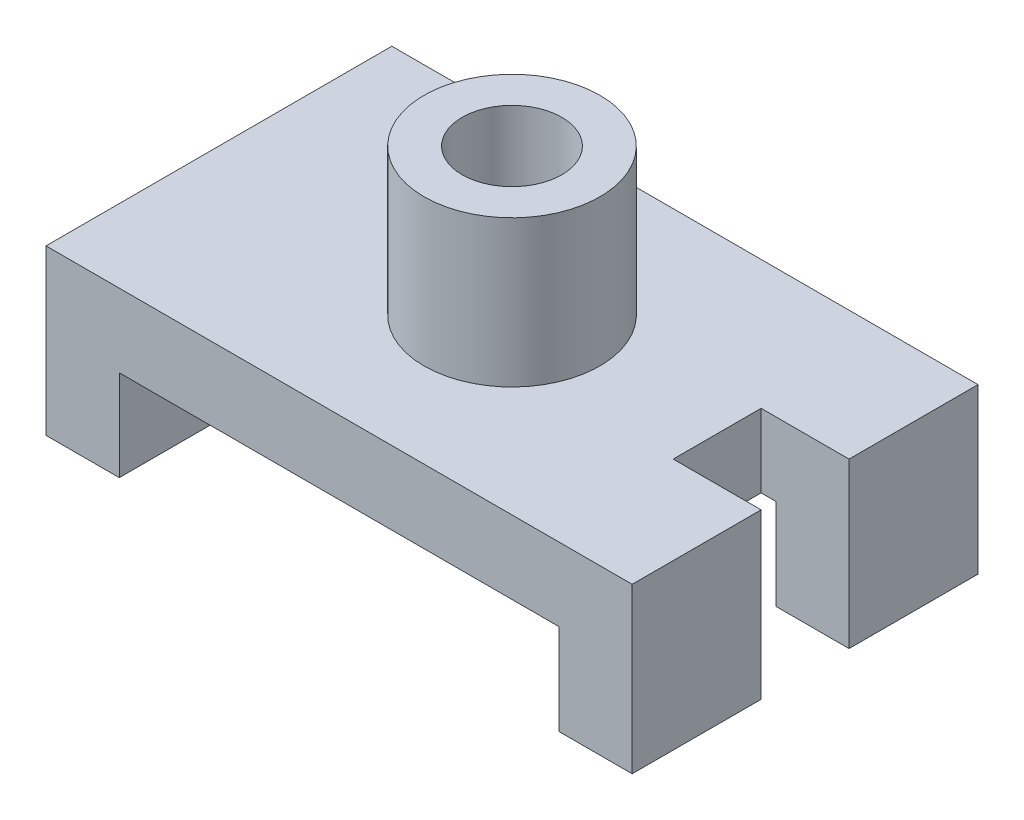
ISO-10303-21;
HEADER;
FILE_DESCRIPTION(('STEP AP214'),'2;1');
FILE_NAME('part.step','',(''),(''),'','','');
FILE_SCHEMA(('AUTOMOTIVE_DESIGN { 1 0 10303 214 1 1 1 1 }'));
ENDSEC;
DATA;
#1=APPLICATION_CONTEXT('core data for automotive mechanical design processes');
#2=APPLICATION_PROTOCOL_DEFINITION('international standard','automotive_design',2000,#1);
#3=PRODUCT_CONTEXT('',#1,'mechanical');
#4=PRODUCT('Part','Part','',(#3));
#5=PRODUCT_RELATED_PRODUCT_CATEGORY('part','',(#4));
#6=PRODUCT_DEFINITION_FORMATION('','',#4);
#7=PRODUCT_DEFINITION_CONTEXT('part definition',#1,'design');
#8=PRODUCT_DEFINITION('design','',#6,#7);
#9=PRODUCT_DEFINITION_SHAPE('','',#8);
#10=(LENGTH_UNIT() NAMED_UNIT(*) SI_UNIT(.MILLI.,.METRE.));
#11=(NAMED_UNIT(*) PLANE_ANGLE_UNIT() SI_UNIT($,.RADIAN.));
#12=(NAMED_UNIT(*) SI_UNIT($,.STERADIAN.) SOLID_ANGLE_UNIT());
#13=UNCERTAINTY_MEASURE_WITH_UNIT(LENGTH_MEASURE(1.E-05),#10,'distance_accuracy_value','');
#14=(GEOMETRIC_REPRESENTATION_CONTEXT(3) GLOBAL_UNCERTAINTY_ASSIGNED_CONTEXT((#13)) GLOBAL_UNIT_ASSIGNED_CONTEXT((#10,
#11,#12)) REPRESENTATION_CONTEXT('',''));
#15=CARTESIAN_POINT('',(0.,0.,0.));
#16=DIRECTION('',(0.,0.,1.));
#17=DIRECTION('',(1.,0.,0.));
#18=AXIS2_PLACEMENT_3D('',#15,#16,#17);
#19=CARTESIAN_POINT('',(2.,0.5,-2.36));
#20=DIRECTION('',(1.,0.,0.));
#21=DIRECTION('',(0.,0.,-1.));
#22=AXIS2_PLACEMENT_3D('',#19,#20,#21);
#23=PLANE('',#22);
#24=DIRECTION('',(0.,1.,0.));
#25=VECTOR('',#24,1.);
#26=CARTESIAN_POINT('',(2.,-0.62,-0.88));
#27=LINE('',#26,#25);
#28=CARTESIAN_POINT('',(2.,-0.62,-0.88));
#29=VERTEX_POINT('',#28);
#30=CARTESIAN_POINT('',(2.,0.5,-0.88));
#31=VERTEX_POINT('',#30);
#32=EDGE_CURVE('E226',#29,#31,#27,.T.);
#33=ORIENTED_EDGE('',*,*,#32,.T.);
#34=DIRECTION('',(0.,0.,1.));
#35=VECTOR('',#34,1.);
#36=CARTESIAN_POINT('',(2.,0.5,-2.36));
#37=LINE('',#36,#35);
#38=CARTESIAN_POINT('',(2.,0.5,0.));
#39=VERTEX_POINT('',#38);
#40=EDGE_CURVE('E136',#31,#39,#37,.T.);
#41=ORIENTED_EDGE('',*,*,#40,.T.);
#42=DIRECTION('',(0.,1.,0.));
#43=VECTOR('',#42,1.);
#44=CARTESIAN_POINT('',(2.,0.5,0.));
#45=LINE('',#44,#43);
#46=CARTESIAN_POINT('',(2.,-0.62,0.));
#47=VERTEX_POINT('',#46);
#48=EDGE_CURVE('E176',#47,#39,#45,.T.);
#49=ORIENTED_EDGE('',*,*,#48,.F.);
#50=DIRECTION('',(0.,0.,1.));
#51=VECTOR('',#50,1.);
#52=CARTESIAN_POINT('',(2.,-0.62,-2.36));
#53=LINE('',#52,#51);
#54=EDGE_CURVE('E137',#29,#47,#53,.T.);
#55=ORIENTED_EDGE('',*,*,#54,.F.);
#56=EDGE_LOOP('',(#33,#41,#49,#55));
#57=FACE_BOUND('',#56,.T.);
#58=ADVANCED_FACE('F41',(#57),#23,.T.);
#59=CARTESIAN_POINT('',(1.5,-0.62,-2.36));
#60=DIRECTION('',(0.,-1.,0.));
#61=DIRECTION('',(1.,0.,0.));
#62=AXIS2_PLACEMENT_3D('',#59,#60,#61);
#63=PLANE('',#62);
#64=DIRECTION('',(1.,0.,0.));
#65=VECTOR('',#64,1.);
#66=CARTESIAN_POINT('',(2.,-0.62,-0.88));
#67=LINE('',#66,#65);
#68=CARTESIAN_POINT('',(1.5,-0.62,-0.88));
#69=VERTEX_POINT('',#68);
#70=EDGE_CURVE('E271',#69,#29,#67,.T.);
#71=ORIENTED_EDGE('',*,*,#70,.T.);
#72=ORIENTED_EDGE('',*,*,#54,.T.);
#73=DIRECTION('',(1.,0.,0.));
#74=VECTOR('',#73,1.);
#75=CARTESIAN_POINT('',(1.5,-0.62,0.));
#76=LINE('',#75,#74);
#77=CARTESIAN_POINT('',(1.5,-0.62,0.));
#78=VERTEX_POINT('',#77);
#79=EDGE_CURVE('E173',#78,#47,#76,.T.);
#80=ORIENTED_EDGE('',*,*,#79,.F.);
#81=DIRECTION('',(0.,0.,1.));
#82=VECTOR('',#81,1.);
#83=CARTESIAN_POINT('',(1.5,-0.62,-2.36));
#84=LINE('',#83,#82);
#85=EDGE_CURVE('E188',#69,#78,#84,.T.);
#86=ORIENTED_EDGE('',*,*,#85,.F.);
#87=EDGE_LOOP('',(#71,#72,#80,#86));
#88=FACE_BOUND('',#87,.T.);
#89=ADVANCED_FACE('F275',(#88),#63,.T.);
#90=CARTESIAN_POINT('',(1.5,-0.62,-2.36));
#91=DIRECTION('',(-1.,0.,0.));
#92=DIRECTION('',(0.,-1.,0.));
#93=AXIS2_PLACEMENT_3D('',#90,#91,#92);
#94=PLANE('',#93);
#95=DIRECTION('',(0.,1.,0.));
#96=VECTOR('',#95,1.);
#97=CARTESIAN_POINT('',(1.5,-0.62,-0.88));
#98=LINE('',#97,#96);
#99=CARTESIAN_POINT('',(1.5,0.,-0.88));
#100=VERTEX_POINT('',#99);
#101=EDGE_CURVE('E161',#69,#100,#98,.T.);
#102=ORIENTED_EDGE('',*,*,#101,.F.);
#103=ORIENTED_EDGE('',*,*,#85,.T.);
#104=DIRECTION('',(0.,-1.,0.));
#105=VECTOR('',#104,1.);
#106=CARTESIAN_POINT('',(1.5,-0.62,0.));
#107=LINE('',#106,#105);
#108=CARTESIAN_POINT('',(1.5,0.,0.));
#109=VERTEX_POINT('',#108);
#110=EDGE_CURVE('E170',#109,#78,#107,.T.);
#111=ORIENTED_EDGE('',*,*,#110,.F.);
#112=DIRECTION('',(0.,0.,1.));
#113=VECTOR('',#112,1.);
#114=CARTESIAN_POINT('',(1.5,0.,-2.36));
#115=LINE('',#114,#113);
#116=EDGE_CURVE('E192',#100,#109,#115,.T.);
#117=ORIENTED_EDGE('',*,*,#116,.F.);
#118=EDGE_LOOP('',(#102,#103,#111,#117));
#119=FACE_BOUND('',#118,.T.);
#120=ADVANCED_FACE('F325',(#119),#94,.T.);
#121=CARTESIAN_POINT('',(-2.,0.5,-2.36));
#122=DIRECTION('',(-1.,0.,0.));
#123=DIRECTION('',(0.,0.,1.));
#124=AXIS2_PLACEMENT_3D('',#121,#122,#123);
#125=PLANE('',#124);
#126=DIRECTION('',(0.,-1.,0.));
#127=VECTOR('',#126,1.);
#128=CARTESIAN_POINT('',(-2.,0.5,0.));
#129=LINE('',#128,#127);
#130=CARTESIAN_POINT('',(-2.,0.5,0.));
#131=VERTEX_POINT('',#130);
#132=CARTESIAN_POINT('',(-2.,-0.62,0.));
#133=VERTEX_POINT('',#132);
#134=EDGE_CURVE('E157',#131,#133,#129,.T.);
#135=ORIENTED_EDGE('',*,*,#134,.F.);
#136=DIRECTION('',(0.,0.,1.));
#137=VECTOR('',#136,1.);
#138=CARTESIAN_POINT('',(-2.,0.5,-2.36));
#139=LINE('',#138,#137);
#140=CARTESIAN_POINT('',(-2.,0.5,-2.36));
#141=VERTEX_POINT('',#140);
#142=EDGE_CURVE('E65',#141,#131,#139,.T.);
#143=ORIENTED_EDGE('',*,*,#142,.F.);
#144=DIRECTION('',(0.,-1.,0.));
#145=VECTOR('',#144,1.);
#146=CARTESIAN_POINT('',(-2.,0.5,-2.36));
#147=LINE('',#146,#145);
#148=CARTESIAN_POINT('',(-2.,-0.62,-2.36));
#149=VERTEX_POINT('',#148);
#150=EDGE_CURVE('E182',#141,#149,#147,.T.);
#151=ORIENTED_EDGE('',*,*,#150,.T.);
#152=DIRECTION('',(0.,0.,1.));
#153=VECTOR('',#152,1.);
#154=CARTESIAN_POINT('',(-2.,-0.62,-2.36));
#155=LINE('',#154,#153);
#156=EDGE_CURVE('E104',#149,#133,#155,.T.);
#157=ORIENTED_EDGE('',*,*,#156,.T.);
#158=EDGE_LOOP('',(#135,#143,#151,#157));
#159=FACE_BOUND('',#158,.T.);
#160=ADVANCED_FACE('F43',(#159),#125,.T.);
#161=CARTESIAN_POINT('',(-2.,0.5,-2.36));
#162=DIRECTION('',(0.,1.,0.));
#163=DIRECTION('',(0.,0.,1.));
#164=AXIS2_PLACEMENT_3D('',#161,#162,#163);
#165=PLANE('',#164);
#166=CARTESIAN_POINT('',(0.,0.5,-1.18));
#167=DIRECTION('',(0.,1.,0.));
#168=DIRECTION('',(0.,0.,1.));
#169=AXIS2_PLACEMENT_3D('',#166,#167,#168);
#170=CIRCLE('',#169,0.6);
#171=CARTESIAN_POINT('',(0.,0.5,-0.58));
#172=VERTEX_POINT('',#171);
#173=EDGE_CURVE('E295',#172,#172,#170,.T.);
#174=ORIENTED_EDGE('',*,*,#173,.F.);
#175=EDGE_LOOP('',(#174));
#176=FACE_BOUND('',#175,.T.);
#177=DIRECTION('',(1.,0.,0.));
#178=VECTOR('',#177,1.);
#179=CARTESIAN_POINT('',(2.,0.5,-0.88));
#180=LINE('',#179,#178);
#181=CARTESIAN_POINT('',(1.4,0.5,-0.88));
#182=VERTEX_POINT('',#181);
#183=EDGE_CURVE('E264',#182,#31,#180,.T.);
#184=ORIENTED_EDGE('',*,*,#183,.F.);
#185=DIRECTION('',(0.,0.,1.));
#186=VECTOR('',#185,1.);
#187=CARTESIAN_POINT('',(1.4,0.5,-1.48));
#188=LINE('',#187,#186);
#189=CARTESIAN_POINT('',(1.4,0.5,-1.48));
#190=VERTEX_POINT('',#189);
#191=EDGE_CURVE('E224',#190,#182,#188,.T.);
#192=ORIENTED_EDGE('',*,*,#191,.F.);
#193=DIRECTION('',(-1.,0.,0.));
#194=VECTOR('',#193,1.);
#195=CARTESIAN_POINT('',(2.,0.5,-1.48));
#196=LINE('',#195,#194);
#197=CARTESIAN_POINT('',(2.,0.5,-1.48));
#198=VERTEX_POINT('',#197);
#199=EDGE_CURVE('E282',#198,#190,#196,.T.);
#200=ORIENTED_EDGE('',*,*,#199,.F.);
#201=CARTESIAN_POINT('',(2.,0.5,-2.36));
#202=VERTEX_POINT('',#201);
#203=EDGE_CURVE('E185',#202,#198,#37,.T.);
#204=ORIENTED_EDGE('',*,*,#203,.F.);
#205=DIRECTION('',(-1.,0.,0.));
#206=VECTOR('',#205,1.);
#207=CARTESIAN_POINT('',(-2.,0.5,-2.36));
#208=LINE('',#207,#206);
#209=EDGE_CURVE('E145',#202,#141,#208,.T.);
#210=ORIENTED_EDGE('',*,*,#209,.T.);
#211=ORIENTED_EDGE('',*,*,#142,.T.);
#212=DIRECTION('',(-1.,0.,0.));
#213=VECTOR('',#212,1.);
#214=CARTESIAN_POINT('',(-2.,0.5,0.));
#215=LINE('',#214,#213);
#216=EDGE_CURVE('E179',#39,#131,#215,.T.);
#217=ORIENTED_EDGE('',*,*,#216,.F.);
#218=ORIENTED_EDGE('',*,*,#40,.F.);
#219=EDGE_LOOP('',(#184,#192,#200,#204,#210,#211,#217,#218));
#220=FACE_BOUND('',#219,.T.);
#221=ADVANCED_FACE('F262',(#176,#220),#165,.T.);
#222=DIRECTION('',(0.,1.,0.));
#223=VECTOR('',#222,1.);
#224=CARTESIAN_POINT('',(2.,-0.62,-1.48));
#225=LINE('',#224,#223);
#226=CARTESIAN_POINT('',(2.,-0.62,-1.48));
#227=VERTEX_POINT('',#226);
#228=EDGE_CURVE('E132',#227,#198,#225,.T.);
#229=ORIENTED_EDGE('',*,*,#228,.F.);
#230=CARTESIAN_POINT('',(2.,-0.62,-2.36));
#231=VERTEX_POINT('',#230);
#232=EDGE_CURVE('E124',#231,#227,#53,.T.);
#233=ORIENTED_EDGE('',*,*,#232,.F.);
#234=DIRECTION('',(0.,1.,0.));
#235=VECTOR('',#234,1.);
#236=CARTESIAN_POINT('',(2.,0.5,-2.36));
#237=LINE('',#236,#235);
#238=EDGE_CURVE('E128',#231,#202,#237,.T.);
#239=ORIENTED_EDGE('',*,*,#238,.T.);
#240=ORIENTED_EDGE('',*,*,#203,.T.);
#241=EDGE_LOOP('',(#229,#233,#239,#240));
#242=FACE_BOUND('',#241,.T.);
#243=ADVANCED_FACE('F126',(#242),#23,.T.);
#244=DIRECTION('',(-1.,0.,0.));
#245=VECTOR('',#244,1.);
#246=CARTESIAN_POINT('',(2.,-0.62,-1.48));
#247=LINE('',#246,#245);
#248=CARTESIAN_POINT('',(1.5,-0.62,-1.48));
#249=VERTEX_POINT('',#248);
#250=EDGE_CURVE('E277',#227,#249,#247,.T.);
#251=ORIENTED_EDGE('',*,*,#250,.T.);
#252=CARTESIAN_POINT('',(1.5,-0.62,-2.36));
#253=VERTEX_POINT('',#252);
#254=EDGE_CURVE('E149',#253,#249,#84,.T.);
#255=ORIENTED_EDGE('',*,*,#254,.F.);
#256=DIRECTION('',(1.,0.,0.));
#257=VECTOR('',#256,1.);
#258=CARTESIAN_POINT('',(1.5,-0.62,-2.36));
#259=LINE('',#258,#257);
#260=EDGE_CURVE('E143',#253,#231,#259,.T.);
#261=ORIENTED_EDGE('',*,*,#260,.T.);
#262=ORIENTED_EDGE('',*,*,#232,.T.);
#263=EDGE_LOOP('',(#251,#255,#261,#262));
#264=FACE_BOUND('',#263,.T.);
#265=ADVANCED_FACE('F147',(#264),#63,.T.);
#266=DIRECTION('',(0.,-1.,0.));
#267=VECTOR('',#266,1.);
#268=CARTESIAN_POINT('',(1.5,-0.62,-1.48));
#269=LINE('',#268,#267);
#270=CARTESIAN_POINT('',(1.5,0.,-1.48));
#271=VERTEX_POINT('',#270);
#272=EDGE_CURVE('E235',#271,#249,#269,.T.);
#273=ORIENTED_EDGE('',*,*,#272,.F.);
#274=CARTESIAN_POINT('',(1.5,0.,-2.36));
#275=VERTEX_POINT('',#274);
#276=EDGE_CURVE('E189',#275,#271,#115,.T.);
#277=ORIENTED_EDGE('',*,*,#276,.F.);
#278=DIRECTION('',(0.,-1.,0.));
#279=VECTOR('',#278,1.);
#280=CARTESIAN_POINT('',(1.5,-0.62,-2.36));
#281=LINE('',#280,#279);
#282=EDGE_CURVE('E150',#275,#253,#281,.T.);
#283=ORIENTED_EDGE('',*,*,#282,.T.);
#284=ORIENTED_EDGE('',*,*,#254,.T.);
#285=EDGE_LOOP('',(#273,#277,#283,#284));
#286=FACE_BOUND('',#285,.T.);
#287=ADVANCED_FACE('F238',(#286),#94,.T.);
#288=CARTESIAN_POINT('',(-1.5,0.,-2.36));
#289=DIRECTION('',(0.,-1.,0.));
#290=DIRECTION('',(1.,0.,0.));
#291=AXIS2_PLACEMENT_3D('',#288,#289,#290);
#292=PLANE('',#291);
#293=DIRECTION('',(-1.,0.,0.));
#294=VECTOR('',#293,1.);
#295=CARTESIAN_POINT('',(-1.5,0.,-0.879999999999999));
#296=LINE('',#295,#294);
#297=CARTESIAN_POINT('',(1.4,0.,-0.88));
#298=VERTEX_POINT('',#297);
#299=EDGE_CURVE('E49',#100,#298,#296,.T.);
#300=ORIENTED_EDGE('',*,*,#299,.F.);
#301=ORIENTED_EDGE('',*,*,#116,.T.);
#302=DIRECTION('',(1.,0.,0.));
#303=VECTOR('',#302,1.);
#304=CARTESIAN_POINT('',(-1.5,0.,0.));
#305=LINE('',#304,#303);
#306=CARTESIAN_POINT('',(-1.5,0.,0.));
#307=VERTEX_POINT('',#306);
#308=EDGE_CURVE('E167',#307,#109,#305,.T.);
#309=ORIENTED_EDGE('',*,*,#308,.F.);
#310=DIRECTION('',(0.,0.,1.));
#311=VECTOR('',#310,1.);
#312=CARTESIAN_POINT('',(-1.5,0.,-2.36));
#313=LINE('',#312,#311);
#314=CARTESIAN_POINT('',(-1.5,0.,-2.36));
#315=VERTEX_POINT('',#314);
#316=EDGE_CURVE('E193',#315,#307,#313,.T.);
#317=ORIENTED_EDGE('',*,*,#316,.F.);
#318=DIRECTION('',(1.,0.,0.));
#319=VECTOR('',#318,1.);
#320=CARTESIAN_POINT('',(-1.5,0.,-2.36));
#321=LINE('',#320,#319);
#322=EDGE_CURVE('E152',#315,#275,#321,.T.);
#323=ORIENTED_EDGE('',*,*,#322,.T.);
#324=ORIENTED_EDGE('',*,*,#276,.T.);
#325=DIRECTION('',(1.,0.,0.));
#326=VECTOR('',#325,1.);
#327=CARTESIAN_POINT('',(-1.5,0.,-1.48));
#328=LINE('',#327,#326);
#329=CARTESIAN_POINT('',(1.4,0.,-1.48));
#330=VERTEX_POINT('',#329);
#331=EDGE_CURVE('E184',#330,#271,#328,.T.);
#332=ORIENTED_EDGE('',*,*,#331,.F.);
#333=DIRECTION('',(0.,0.,-1.));
#334=VECTOR('',#333,1.);
#335=CARTESIAN_POINT('',(1.4,0.,-2.36));
#336=LINE('',#335,#334);
#337=EDGE_CURVE('E199',#298,#330,#336,.T.);
#338=ORIENTED_EDGE('',*,*,#337,.F.);
#339=EDGE_LOOP('',(#300,#301,#309,#317,#323,#324,#332,#338));
#340=FACE_BOUND('',#339,.T.);
#341=ADVANCED_FACE('F228',(#340),#292,.T.);
#342=CARTESIAN_POINT('',(-1.5,-0.62,-2.36));
#343=DIRECTION('',(1.,0.,0.));
#344=DIRECTION('',(0.,1.,0.));
#345=AXIS2_PLACEMENT_3D('',#342,#343,#344);
#346=PLANE('',#345);
#347=DIRECTION('',(0.,1.,0.));
#348=VECTOR('',#347,1.);
#349=CARTESIAN_POINT('',(-1.5,-0.62,0.));
#350=LINE('',#349,#348);
#351=CARTESIAN_POINT('',(-1.5,-0.62,0.));
#352=VERTEX_POINT('',#351);
#353=EDGE_CURVE('E164',#352,#307,#350,.T.);
#354=ORIENTED_EDGE('',*,*,#353,.F.);
#355=DIRECTION('',(0.,0.,1.));
#356=VECTOR('',#355,1.);
#357=CARTESIAN_POINT('',(-1.5,-0.62,-2.36));
#358=LINE('',#357,#356);
#359=CARTESIAN_POINT('',(-1.5,-0.62,-2.36));
#360=VERTEX_POINT('',#359);
#361=EDGE_CURVE('E195',#360,#352,#358,.T.);
#362=ORIENTED_EDGE('',*,*,#361,.F.);
#363=DIRECTION('',(0.,1.,0.));
#364=VECTOR('',#363,1.);
#365=CARTESIAN_POINT('',(-1.5,-0.62,-2.36));
#366=LINE('',#365,#364);
#367=EDGE_CURVE('E249',#360,#315,#366,.T.);
#368=ORIENTED_EDGE('',*,*,#367,.T.);
#369=ORIENTED_EDGE('',*,*,#316,.T.);
#370=EDGE_LOOP('',(#354,#362,#368,#369));
#371=FACE_BOUND('',#370,.T.);
#372=ADVANCED_FACE('F256',(#371),#346,.T.);
#373=CARTESIAN_POINT('',(-2.,-0.62,-2.36));
#374=DIRECTION('',(0.,-1.,0.));
#375=DIRECTION('',(0.,0.,-1.));
#376=AXIS2_PLACEMENT_3D('',#373,#374,#375);
#377=PLANE('',#376);
#378=DIRECTION('',(1.,0.,0.));
#379=VECTOR('',#378,1.);
#380=CARTESIAN_POINT('',(-2.,-0.62,0.));
#381=LINE('',#380,#379);
#382=EDGE_CURVE('E160',#133,#352,#381,.T.);
#383=ORIENTED_EDGE('',*,*,#382,.F.);
#384=ORIENTED_EDGE('',*,*,#156,.F.);
#385=DIRECTION('',(1.,0.,0.));
#386=VECTOR('',#385,1.);
#387=CARTESIAN_POINT('',(-2.,-0.62,-2.36));
#388=LINE('',#387,#386);
#389=EDGE_CURVE('E247',#149,#360,#388,.T.);
#390=ORIENTED_EDGE('',*,*,#389,.T.);
#391=ORIENTED_EDGE('',*,*,#361,.T.);
#392=EDGE_LOOP('',(#383,#384,#390,#391));
#393=FACE_BOUND('',#392,.T.);
#394=ADVANCED_FACE('F257',(#393),#377,.T.);
#395=CARTESIAN_POINT('',(0.,0.,-2.36));
#396=DIRECTION('',(0.,0.,1.));
#397=DIRECTION('',(1.,0.,0.));
#398=AXIS2_PLACEMENT_3D('',#395,#396,#397);
#399=PLANE('',#398);
#400=ORIENTED_EDGE('',*,*,#150,.F.);
#401=ORIENTED_EDGE('',*,*,#209,.F.);
#402=ORIENTED_EDGE('',*,*,#238,.F.);
#403=ORIENTED_EDGE('',*,*,#260,.F.);
#404=ORIENTED_EDGE('',*,*,#282,.F.);
#405=ORIENTED_EDGE('',*,*,#322,.F.);
#406=ORIENTED_EDGE('',*,*,#367,.F.);
#407=ORIENTED_EDGE('',*,*,#389,.F.);
#408=EDGE_LOOP('',(#400,#401,#402,#403,#404,#405,#406,#407));
#409=FACE_BOUND('',#408,.T.);
#410=ADVANCED_FACE('F141',(#409),#399,.F.);
#411=CARTESIAN_POINT('',(0.,0.,0.));
#412=DIRECTION('',(0.,0.,1.));
#413=DIRECTION('',(1.,0.,0.));
#414=AXIS2_PLACEMENT_3D('',#411,#412,#413);
#415=PLANE('',#414);
#416=ORIENTED_EDGE('',*,*,#134,.T.);
#417=ORIENTED_EDGE('',*,*,#382,.T.);
#418=ORIENTED_EDGE('',*,*,#353,.T.);
#419=ORIENTED_EDGE('',*,*,#308,.T.);
#420=ORIENTED_EDGE('',*,*,#110,.T.);
#421=ORIENTED_EDGE('',*,*,#79,.T.);
#422=ORIENTED_EDGE('',*,*,#48,.T.);
#423=ORIENTED_EDGE('',*,*,#216,.T.);
#424=EDGE_LOOP('',(#416,#417,#418,#419,#420,#421,#422,#423));
#425=FACE_BOUND('',#424,.T.);
#426=ADVANCED_FACE('F259',(#425),#415,.T.);
#427=CARTESIAN_POINT('',(2.,-0.62,-0.88));
#428=DIRECTION('',(0.,0.,1.));
#429=DIRECTION('',(1.,0.,0.));
#430=AXIS2_PLACEMENT_3D('',#427,#428,#429);
#431=PLANE('',#430);
#432=ORIENTED_EDGE('',*,*,#101,.T.);
#433=ORIENTED_EDGE('',*,*,#299,.T.);
#434=DIRECTION('',(0.,1.,0.));
#435=VECTOR('',#434,1.);
#436=CARTESIAN_POINT('',(1.4,-0.62,-0.88));
#437=LINE('',#436,#435);
#438=EDGE_CURVE('E210',#298,#182,#437,.T.);
#439=ORIENTED_EDGE('',*,*,#438,.T.);
#440=ORIENTED_EDGE('',*,*,#183,.T.);
#441=ORIENTED_EDGE('',*,*,#32,.F.);
#442=ORIENTED_EDGE('',*,*,#70,.F.);
#443=EDGE_LOOP('',(#432,#433,#439,#440,#441,#442));
#444=FACE_BOUND('',#443,.T.);
#445=ADVANCED_FACE('F207',(#444),#431,.F.);
#446=CARTESIAN_POINT('',(1.4,-0.62,-1.48));
#447=DIRECTION('',(-1.,0.,0.));
#448=DIRECTION('',(0.,0.,1.));
#449=AXIS2_PLACEMENT_3D('',#446,#447,#448);
#450=PLANE('',#449);
#451=ORIENTED_EDGE('',*,*,#337,.T.);
#452=DIRECTION('',(0.,1.,0.));
#453=VECTOR('',#452,1.);
#454=CARTESIAN_POINT('',(1.4,-0.62,-1.48));
#455=LINE('',#454,#453);
#456=EDGE_CURVE('E56',#330,#190,#455,.T.);
#457=ORIENTED_EDGE('',*,*,#456,.T.);
#458=ORIENTED_EDGE('',*,*,#191,.T.);
#459=ORIENTED_EDGE('',*,*,#438,.F.);
#460=EDGE_LOOP('',(#451,#457,#458,#459));
#461=FACE_BOUND('',#460,.T.);
#462=ADVANCED_FACE('F221',(#461),#450,.F.);
#463=CARTESIAN_POINT('',(2.,-0.62,-1.48));
#464=DIRECTION('',(0.,0.,-1.));
#465=DIRECTION('',(-1.,0.,0.));
#466=AXIS2_PLACEMENT_3D('',#463,#464,#465);
#467=PLANE('',#466);
#468=ORIENTED_EDGE('',*,*,#272,.T.);
#469=ORIENTED_EDGE('',*,*,#250,.F.);
#470=ORIENTED_EDGE('',*,*,#228,.T.);
#471=ORIENTED_EDGE('',*,*,#199,.T.);
#472=ORIENTED_EDGE('',*,*,#456,.F.);
#473=ORIENTED_EDGE('',*,*,#331,.T.);
#474=EDGE_LOOP('',(#468,#469,#470,#471,#472,#473));
#475=FACE_BOUND('',#474,.T.);
#476=ADVANCED_FACE('F232',(#475),#467,.F.);
#477=CARTESIAN_POINT('',(0.,1.5,-1.18));
#478=DIRECTION('',(0.,1.,0.));
#479=DIRECTION('',(0.,0.,1.));
#480=AXIS2_PLACEMENT_3D('',#477,#478,#479);
#481=PLANE('',#480);
#482=CARTESIAN_POINT('',(0.,1.5,-1.18));
#483=DIRECTION('',(0.,1.,0.));
#484=DIRECTION('',(0.,0.,1.));
#485=AXIS2_PLACEMENT_3D('',#482,#483,#484);
#486=CIRCLE('',#485,0.6);
#487=CARTESIAN_POINT('',(0.,1.5,-0.58));
#488=VERTEX_POINT('',#487);
#489=EDGE_CURVE('E284',#488,#488,#486,.T.);
#490=ORIENTED_EDGE('',*,*,#489,.T.);
#491=EDGE_LOOP('',(#490));
#492=FACE_BOUND('',#491,.T.);
#493=CARTESIAN_POINT('',(0.,1.5,-1.18));
#494=DIRECTION('',(0.,1.,0.));
#495=DIRECTION('',(0.,0.,1.));
#496=AXIS2_PLACEMENT_3D('',#493,#494,#495);
#497=CIRCLE('',#496,0.34);
#498=CARTESIAN_POINT('',(0.,1.5,-0.84));
#499=VERTEX_POINT('',#498);
#500=EDGE_CURVE('E300',#499,#499,#497,.T.);
#501=ORIENTED_EDGE('',*,*,#500,.F.);
#502=EDGE_LOOP('',(#501));
#503=FACE_BOUND('',#502,.T.);
#504=ADVANCED_FACE('F308',(#492,#503),#481,.T.);
#505=CARTESIAN_POINT('',(0.,1.5,-1.18));
#506=DIRECTION('',(0.,-1.,0.));
#507=DIRECTION('',(0.,0.,-1.));
#508=AXIS2_PLACEMENT_3D('',#505,#506,#507);
#509=CYLINDRICAL_SURFACE('',#508,0.6);
#510=ORIENTED_EDGE('',*,*,#489,.F.);
#511=EDGE_LOOP('',(#510));
#512=FACE_BOUND('',#511,.T.);
#513=ORIENTED_EDGE('',*,*,#173,.T.);
#514=EDGE_LOOP('',(#513));
#515=FACE_BOUND('',#514,.T.);
#516=ADVANCED_FACE('F310',(#512,#515),#509,.T.);
#517=CARTESIAN_POINT('',(0.,1.5,-1.18));
#518=DIRECTION('',(0.,-1.,0.));
#519=DIRECTION('',(0.,0.,-1.));
#520=AXIS2_PLACEMENT_3D('',#517,#518,#519);
#521=CYLINDRICAL_SURFACE('',#520,0.34);
#522=ORIENTED_EDGE('',*,*,#500,.T.);
#523=EDGE_LOOP('',(#522));
#524=FACE_BOUND('',#523,.T.);
#525=CARTESIAN_POINT('',(0.,0.5,-1.18));
#526=DIRECTION('',(0.,1.,0.));
#527=DIRECTION('',(0.,0.,1.));
#528=AXIS2_PLACEMENT_3D('',#525,#526,#527);
#529=CIRCLE('',#528,0.34);
#530=CARTESIAN_POINT('',(0.,0.5,-0.84));
#531=VERTEX_POINT('',#530);
#532=EDGE_CURVE('E11',#531,#531,#529,.F.);
#533=ORIENTED_EDGE('',*,*,#532,.T.);
#534=EDGE_LOOP('',(#533));
#535=FACE_BOUND('',#534,.T.);
#536=ADVANCED_FACE('F305',(#524,#535),#521,.F.);
#537=ORIENTED_EDGE('',*,*,#532,.F.);
#538=EDGE_LOOP('',(#537));
#539=FACE_BOUND('',#538,.T.);
#540=ADVANCED_FACE('F334',(#539),#165,.T.);
#541=CLOSED_SHELL('',(#58,#89,#120,#160,#221,#243,#265,#287,#341,#372,#394,#410,#426,#445,#462,
#476,#504,#516,#536,#540));
#542=MANIFOLD_SOLID_BREP('B2',#541);
#543=ADVANCED_BREP_SHAPE_REPRESENTATION('',(#18,#542),#14);
#544=SHAPE_DEFINITION_REPRESENTATION(#9,#543);
ENDSEC;
END-ISO-10303-21;
